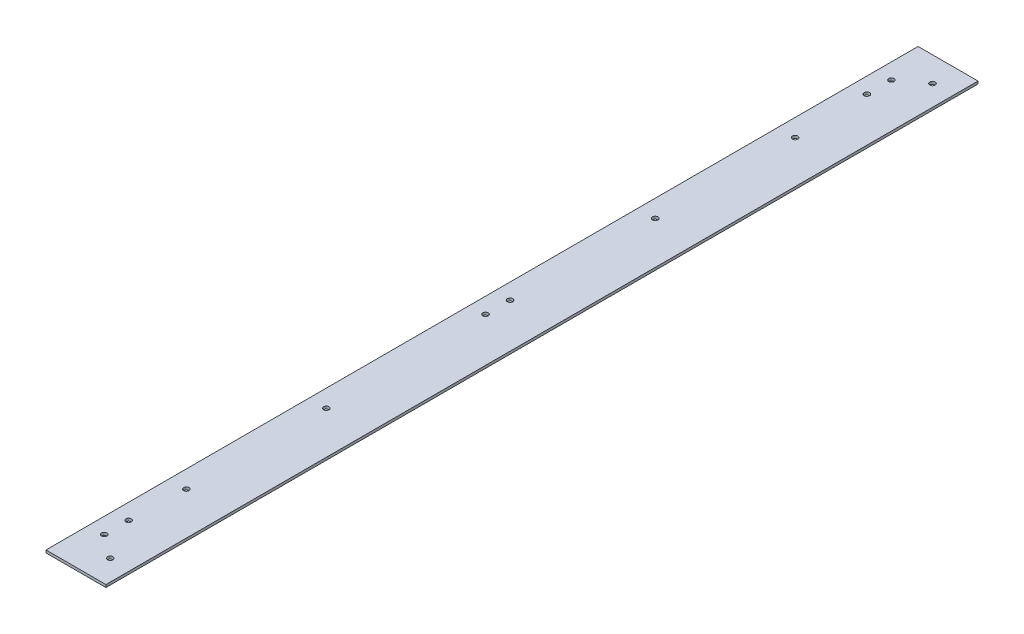
ISO-10303-21;
HEADER;
FILE_DESCRIPTION(('STEP AP214'),'2;1');
FILE_NAME('part.step','',(''),(''),'','','');
FILE_SCHEMA(('AUTOMOTIVE_DESIGN { 1 0 10303 214 1 1 1 1 }'));
ENDSEC;
DATA;
#1=APPLICATION_CONTEXT('core data for automotive mechanical design processes');
#2=APPLICATION_PROTOCOL_DEFINITION('international standard','automotive_design',2000,#1);
#3=PRODUCT_CONTEXT('',#1,'mechanical');
#4=PRODUCT('Part','Part','',(#3));
#5=PRODUCT_RELATED_PRODUCT_CATEGORY('part','',(#4));
#6=PRODUCT_DEFINITION_FORMATION('','',#4);
#7=PRODUCT_DEFINITION_CONTEXT('part definition',#1,'design');
#8=PRODUCT_DEFINITION('design','',#6,#7);
#9=PRODUCT_DEFINITION_SHAPE('','',#8);
#10=(LENGTH_UNIT() NAMED_UNIT(*) SI_UNIT(.MILLI.,.METRE.));
#11=(NAMED_UNIT(*) PLANE_ANGLE_UNIT() SI_UNIT($,.RADIAN.));
#12=(NAMED_UNIT(*) SI_UNIT($,.STERADIAN.) SOLID_ANGLE_UNIT());
#13=UNCERTAINTY_MEASURE_WITH_UNIT(LENGTH_MEASURE(1.E-05),#10,'distance_accuracy_value','');
#14=(GEOMETRIC_REPRESENTATION_CONTEXT(3) GLOBAL_UNCERTAINTY_ASSIGNED_CONTEXT((#13)) GLOBAL_UNIT_ASSIGNED_CONTEXT((#10,
#11,#12)) REPRESENTATION_CONTEXT('',''));
#15=CARTESIAN_POINT('',(0.,0.,0.));
#16=DIRECTION('',(0.,0.,1.));
#17=DIRECTION('',(1.,0.,0.));
#18=AXIS2_PLACEMENT_3D('',#15,#16,#17);
#19=CARTESIAN_POINT('',(0.,1.5,0.));
#20=DIRECTION('',(0.,1.,0.));
#21=DIRECTION('',(0.,0.,1.));
#22=AXIS2_PLACEMENT_3D('',#19,#20,#21);
#23=PLANE('',#22);
#24=CARTESIAN_POINT('',(22.5000000000001,1.5,485.));
#25=DIRECTION('',(0.,1.,0.));
#26=DIRECTION('',(0.,0.,1.));
#27=AXIS2_PLACEMENT_3D('',#24,#25,#26);
#28=CIRCLE('',#27,1.55000000000002);
#29=CARTESIAN_POINT('',(22.5000000000001,1.5,486.55));
#30=VERTEX_POINT('',#29);
#31=EDGE_CURVE('E172',#30,#30,#28,.T.);
#32=ORIENTED_EDGE('',*,*,#31,.F.);
#33=EDGE_LOOP('',(#32));
#34=FACE_BOUND('',#33,.T.);
#35=CARTESIAN_POINT('',(22.5,1.5,15.));
#36=DIRECTION('',(0.,1.,0.));
#37=DIRECTION('',(0.,0.,1.));
#38=AXIS2_PLACEMENT_3D('',#35,#36,#37);
#39=CIRCLE('',#38,1.55);
#40=CARTESIAN_POINT('',(22.5,1.5,16.55));
#41=VERTEX_POINT('',#40);
#42=EDGE_CURVE('E52',#41,#41,#39,.T.);
#43=ORIENTED_EDGE('',*,*,#42,.F.);
#44=EDGE_LOOP('',(#43));
#45=FACE_BOUND('',#44,.T.);
#46=CARTESIAN_POINT('',(9.,1.5,243.));
#47=DIRECTION('',(0.,1.,0.));
#48=DIRECTION('',(0.,0.,1.));
#49=AXIS2_PLACEMENT_3D('',#46,#47,#48);
#50=CIRCLE('',#49,1.54999999999999);
#51=CARTESIAN_POINT('',(9.,1.5,244.55));
#52=VERTEX_POINT('',#51);
#53=EDGE_CURVE('E178',#52,#52,#50,.T.);
#54=ORIENTED_EDGE('',*,*,#53,.F.);
#55=EDGE_LOOP('',(#54));
#56=FACE_BOUND('',#55,.T.);
#57=CARTESIAN_POINT('',(9.,1.5,475.));
#58=DIRECTION('',(0.,1.,0.));
#59=DIRECTION('',(0.,0.,1.));
#60=AXIS2_PLACEMENT_3D('',#57,#58,#59);
#61=CIRCLE('',#60,1.55000000000003);
#62=CARTESIAN_POINT('',(9.,1.5,476.55));
#63=VERTEX_POINT('',#62);
#64=EDGE_CURVE('E179',#63,#63,#61,.T.);
#65=ORIENTED_EDGE('',*,*,#64,.F.);
#66=EDGE_LOOP('',(#65));
#67=FACE_BOUND('',#66,.T.);
#68=CARTESIAN_POINT('',(9.,1.5,461.));
#69=DIRECTION('',(0.,1.,0.));
#70=DIRECTION('',(0.,0.,1.));
#71=AXIS2_PLACEMENT_3D('',#68,#69,#70);
#72=CIRCLE('',#71,1.55000000000003);
#73=CARTESIAN_POINT('',(9.,1.5,462.55));
#74=VERTEX_POINT('',#73);
#75=EDGE_CURVE('E186',#74,#74,#72,.T.);
#76=ORIENTED_EDGE('',*,*,#75,.F.);
#77=EDGE_LOOP('',(#76));
#78=FACE_BOUND('',#77,.T.);
#79=CARTESIAN_POINT('',(9.,1.5,39.));
#80=DIRECTION('',(0.,1.,0.));
#81=DIRECTION('',(0.,0.,1.));
#82=AXIS2_PLACEMENT_3D('',#79,#80,#81);
#83=CIRCLE('',#82,1.55);
#84=CARTESIAN_POINT('',(9.,1.5,40.55));
#85=VERTEX_POINT('',#84);
#86=EDGE_CURVE('E191',#85,#85,#83,.T.);
#87=ORIENTED_EDGE('',*,*,#86,.F.);
#88=EDGE_LOOP('',(#87));
#89=FACE_BOUND('',#88,.T.);
#90=CARTESIAN_POINT('',(9.,1.5,257.));
#91=DIRECTION('',(0.,1.,0.));
#92=DIRECTION('',(0.,0.,1.));
#93=AXIS2_PLACEMENT_3D('',#90,#91,#92);
#94=CIRCLE('',#93,1.55);
#95=CARTESIAN_POINT('',(9.,1.5,258.55));
#96=VERTEX_POINT('',#95);
#97=EDGE_CURVE('E144',#96,#96,#94,.T.);
#98=ORIENTED_EDGE('',*,*,#97,.F.);
#99=EDGE_LOOP('',(#98));
#100=FACE_BOUND('',#99,.T.);
#101=CARTESIAN_POINT('',(9.,1.5,25.));
#102=DIRECTION('',(0.,1.,0.));
#103=DIRECTION('',(0.,0.,1.));
#104=AXIS2_PLACEMENT_3D('',#101,#102,#103);
#105=CIRCLE('',#104,1.55);
#106=CARTESIAN_POINT('',(9.,1.5,26.55));
#107=VERTEX_POINT('',#106);
#108=EDGE_CURVE('E163',#107,#107,#105,.T.);
#109=ORIENTED_EDGE('',*,*,#108,.F.);
#110=EDGE_LOOP('',(#109));
#111=FACE_BOUND('',#110,.T.);
#112=CARTESIAN_POINT('',(10.0000000000001,1.5,429.));
#113=DIRECTION('',(0.,1.,0.));
#114=DIRECTION('',(0.,0.,1.));
#115=AXIS2_PLACEMENT_3D('',#112,#113,#114);
#116=CIRCLE('',#115,1.55000000000003);
#117=CARTESIAN_POINT('',(10.0000000000001,1.5,430.55));
#118=VERTEX_POINT('',#117);
#119=EDGE_CURVE('E122',#118,#118,#116,.T.);
#120=ORIENTED_EDGE('',*,*,#119,.F.);
#121=EDGE_LOOP('',(#120));
#122=FACE_BOUND('',#121,.T.);
#123=CARTESIAN_POINT('',(10.0000000000001,1.5,349.));
#124=DIRECTION('',(0.,1.,0.));
#125=DIRECTION('',(0.,0.,1.));
#126=AXIS2_PLACEMENT_3D('',#123,#124,#125);
#127=CIRCLE('',#126,1.55000000000001);
#128=CARTESIAN_POINT('',(10.0000000000001,1.5,350.55));
#129=VERTEX_POINT('',#128);
#130=EDGE_CURVE('E153',#129,#129,#127,.T.);
#131=ORIENTED_EDGE('',*,*,#130,.F.);
#132=EDGE_LOOP('',(#131));
#133=FACE_BOUND('',#132,.T.);
#134=CARTESIAN_POINT('',(10.,1.5,161.));
#135=DIRECTION('',(0.,1.,0.));
#136=DIRECTION('',(0.,0.,1.));
#137=AXIS2_PLACEMENT_3D('',#134,#135,#136);
#138=CIRCLE('',#137,1.54999999999999);
#139=CARTESIAN_POINT('',(10.,1.5,162.55));
#140=VERTEX_POINT('',#139);
#141=EDGE_CURVE('E145',#140,#140,#138,.T.);
#142=ORIENTED_EDGE('',*,*,#141,.F.);
#143=EDGE_LOOP('',(#142));
#144=FACE_BOUND('',#143,.T.);
#145=CARTESIAN_POINT('',(10.,1.5,81.));
#146=DIRECTION('',(0.,1.,0.));
#147=DIRECTION('',(0.,0.,1.));
#148=AXIS2_PLACEMENT_3D('',#145,#146,#147);
#149=CIRCLE('',#148,1.54999999999999);
#150=CARTESIAN_POINT('',(10.,1.5,82.55));
#151=VERTEX_POINT('',#150);
#152=EDGE_CURVE('E135',#151,#151,#149,.T.);
#153=ORIENTED_EDGE('',*,*,#152,.F.);
#154=EDGE_LOOP('',(#153));
#155=FACE_BOUND('',#154,.T.);
#156=DIRECTION('',(-1.,0.,0.));
#157=VECTOR('',#156,1.);
#158=CARTESIAN_POINT('',(34.25,1.5,0.75));
#159=LINE('',#158,#157);
#160=CARTESIAN_POINT('',(34.25,1.5,0.75));
#161=VERTEX_POINT('',#160);
#162=CARTESIAN_POINT('',(0.,1.5,0.75));
#163=VERTEX_POINT('',#162);
#164=EDGE_CURVE('E90',#161,#163,#159,.T.);
#165=ORIENTED_EDGE('',*,*,#164,.T.);
#166=DIRECTION('',(0.,0.,1.));
#167=VECTOR('',#166,1.);
#168=CARTESIAN_POINT('',(0.,1.5,0.75));
#169=LINE('',#168,#167);
#170=CARTESIAN_POINT('',(0.,1.5,499.25));
#171=VERTEX_POINT('',#170);
#172=EDGE_CURVE('E94',#163,#171,#169,.T.);
#173=ORIENTED_EDGE('',*,*,#172,.T.);
#174=DIRECTION('',(1.,0.,0.));
#175=VECTOR('',#174,1.);
#176=CARTESIAN_POINT('',(0.750000000000061,1.5,499.25));
#177=LINE('',#176,#175);
#178=CARTESIAN_POINT('',(34.2500000000001,1.5,499.25));
#179=VERTEX_POINT('',#178);
#180=EDGE_CURVE('E98',#171,#179,#177,.T.);
#181=ORIENTED_EDGE('',*,*,#180,.T.);
#182=DIRECTION('',(0.,0.,-1.));
#183=VECTOR('',#182,1.);
#184=CARTESIAN_POINT('',(34.2500000000001,1.5,499.25));
#185=LINE('',#184,#183);
#186=EDGE_CURVE('E96',#179,#161,#185,.T.);
#187=ORIENTED_EDGE('',*,*,#186,.T.);
#188=EDGE_LOOP('',(#165,#173,#181,#187));
#189=FACE_BOUND('',#188,.T.);
#190=ADVANCED_FACE('F42',(#34,#45,#56,#67,#78,#89,#100,#111,#122,#133,#144,#155,#189),#23,.T.);
#191=CARTESIAN_POINT('',(0.,0.,0.));
#192=DIRECTION('',(0.,1.,0.));
#193=DIRECTION('',(0.,0.,1.));
#194=AXIS2_PLACEMENT_3D('',#191,#192,#193);
#195=PLANE('',#194);
#196=CARTESIAN_POINT('',(22.5000000000001,0.,485.));
#197=DIRECTION('',(0.,1.,0.));
#198=DIRECTION('',(0.,0.,1.));
#199=AXIS2_PLACEMENT_3D('',#196,#197,#198);
#200=CIRCLE('',#199,1.55000000000002);
#201=CARTESIAN_POINT('',(22.5000000000001,0.,486.55));
#202=VERTEX_POINT('',#201);
#203=EDGE_CURVE('E46',#202,#202,#200,.F.);
#204=ORIENTED_EDGE('',*,*,#203,.F.);
#205=EDGE_LOOP('',(#204));
#206=FACE_BOUND('',#205,.T.);
#207=CARTESIAN_POINT('',(22.5,0.,15.));
#208=DIRECTION('',(0.,1.,0.));
#209=DIRECTION('',(0.,0.,1.));
#210=AXIS2_PLACEMENT_3D('',#207,#208,#209);
#211=CIRCLE('',#210,1.55);
#212=CARTESIAN_POINT('',(22.5,0.,16.55));
#213=VERTEX_POINT('',#212);
#214=EDGE_CURVE('E12',#213,#213,#211,.F.);
#215=ORIENTED_EDGE('',*,*,#214,.F.);
#216=EDGE_LOOP('',(#215));
#217=FACE_BOUND('',#216,.T.);
#218=CARTESIAN_POINT('',(9.,0.,243.));
#219=DIRECTION('',(0.,1.,0.));
#220=DIRECTION('',(0.,0.,1.));
#221=AXIS2_PLACEMENT_3D('',#218,#219,#220);
#222=CIRCLE('',#221,1.54999999999999);
#223=CARTESIAN_POINT('',(9.,0.,244.55));
#224=VERTEX_POINT('',#223);
#225=EDGE_CURVE('E183',#224,#224,#222,.F.);
#226=ORIENTED_EDGE('',*,*,#225,.F.);
#227=EDGE_LOOP('',(#226));
#228=FACE_BOUND('',#227,.T.);
#229=CARTESIAN_POINT('',(9.,0.,475.));
#230=DIRECTION('',(0.,1.,0.));
#231=DIRECTION('',(0.,0.,1.));
#232=AXIS2_PLACEMENT_3D('',#229,#230,#231);
#233=CIRCLE('',#232,1.55000000000003);
#234=CARTESIAN_POINT('',(9.,0.,476.55));
#235=VERTEX_POINT('',#234);
#236=EDGE_CURVE('E182',#235,#235,#233,.F.);
#237=ORIENTED_EDGE('',*,*,#236,.F.);
#238=EDGE_LOOP('',(#237));
#239=FACE_BOUND('',#238,.T.);
#240=CARTESIAN_POINT('',(9.,0.,461.));
#241=DIRECTION('',(0.,1.,0.));
#242=DIRECTION('',(0.,0.,1.));
#243=AXIS2_PLACEMENT_3D('',#240,#241,#242);
#244=CIRCLE('',#243,1.55000000000003);
#245=CARTESIAN_POINT('',(9.,0.,462.55));
#246=VERTEX_POINT('',#245);
#247=EDGE_CURVE('E195',#246,#246,#244,.F.);
#248=ORIENTED_EDGE('',*,*,#247,.F.);
#249=EDGE_LOOP('',(#248));
#250=FACE_BOUND('',#249,.T.);
#251=CARTESIAN_POINT('',(9.,0.,39.));
#252=DIRECTION('',(0.,1.,0.));
#253=DIRECTION('',(0.,0.,1.));
#254=AXIS2_PLACEMENT_3D('',#251,#252,#253);
#255=CIRCLE('',#254,1.55);
#256=CARTESIAN_POINT('',(9.,0.,40.55));
#257=VERTEX_POINT('',#256);
#258=EDGE_CURVE('E168',#257,#257,#255,.F.);
#259=ORIENTED_EDGE('',*,*,#258,.F.);
#260=EDGE_LOOP('',(#259));
#261=FACE_BOUND('',#260,.T.);
#262=CARTESIAN_POINT('',(9.,0.,257.));
#263=DIRECTION('',(0.,1.,0.));
#264=DIRECTION('',(0.,0.,1.));
#265=AXIS2_PLACEMENT_3D('',#262,#263,#264);
#266=CIRCLE('',#265,1.55);
#267=CARTESIAN_POINT('',(9.,0.,258.55));
#268=VERTEX_POINT('',#267);
#269=EDGE_CURVE('E175',#268,#268,#266,.F.);
#270=ORIENTED_EDGE('',*,*,#269,.F.);
#271=EDGE_LOOP('',(#270));
#272=FACE_BOUND('',#271,.T.);
#273=CARTESIAN_POINT('',(9.,0.,25.));
#274=DIRECTION('',(0.,1.,0.));
#275=DIRECTION('',(0.,0.,1.));
#276=AXIS2_PLACEMENT_3D('',#273,#274,#275);
#277=CIRCLE('',#276,1.55);
#278=CARTESIAN_POINT('',(9.,0.,26.55));
#279=VERTEX_POINT('',#278);
#280=EDGE_CURVE('E167',#279,#279,#277,.F.);
#281=ORIENTED_EDGE('',*,*,#280,.F.);
#282=EDGE_LOOP('',(#281));
#283=FACE_BOUND('',#282,.T.);
#284=CARTESIAN_POINT('',(10.0000000000001,0.,429.));
#285=DIRECTION('',(0.,1.,0.));
#286=DIRECTION('',(0.,0.,1.));
#287=AXIS2_PLACEMENT_3D('',#284,#285,#286);
#288=CIRCLE('',#287,1.55000000000003);
#289=CARTESIAN_POINT('',(10.0000000000001,0.,430.55));
#290=VERTEX_POINT('',#289);
#291=EDGE_CURVE('E156',#290,#290,#288,.F.);
#292=ORIENTED_EDGE('',*,*,#291,.F.);
#293=EDGE_LOOP('',(#292));
#294=FACE_BOUND('',#293,.T.);
#295=CARTESIAN_POINT('',(10.0000000000001,0.,349.));
#296=DIRECTION('',(0.,1.,0.));
#297=DIRECTION('',(0.,0.,1.));
#298=AXIS2_PLACEMENT_3D('',#295,#296,#297);
#299=CIRCLE('',#298,1.55000000000001);
#300=CARTESIAN_POINT('',(10.0000000000001,0.,350.55));
#301=VERTEX_POINT('',#300);
#302=EDGE_CURVE('E149',#301,#301,#299,.F.);
#303=ORIENTED_EDGE('',*,*,#302,.F.);
#304=EDGE_LOOP('',(#303));
#305=FACE_BOUND('',#304,.T.);
#306=CARTESIAN_POINT('',(10.,0.,161.));
#307=DIRECTION('',(0.,1.,0.));
#308=DIRECTION('',(0.,0.,1.));
#309=AXIS2_PLACEMENT_3D('',#306,#307,#308);
#310=CIRCLE('',#309,1.54999999999999);
#311=CARTESIAN_POINT('',(10.,0.,162.55));
#312=VERTEX_POINT('',#311);
#313=EDGE_CURVE('E140',#312,#312,#310,.F.);
#314=ORIENTED_EDGE('',*,*,#313,.F.);
#315=EDGE_LOOP('',(#314));
#316=FACE_BOUND('',#315,.T.);
#317=CARTESIAN_POINT('',(10.,0.,81.));
#318=DIRECTION('',(0.,1.,0.));
#319=DIRECTION('',(0.,0.,1.));
#320=AXIS2_PLACEMENT_3D('',#317,#318,#319);
#321=CIRCLE('',#320,1.54999999999999);
#322=CARTESIAN_POINT('',(10.,0.,82.55));
#323=VERTEX_POINT('',#322);
#324=EDGE_CURVE('E139',#323,#323,#321,.F.);
#325=ORIENTED_EDGE('',*,*,#324,.F.);
#326=EDGE_LOOP('',(#325));
#327=FACE_BOUND('',#326,.T.);
#328=DIRECTION('',(-1.,0.,0.));
#329=VECTOR('',#328,1.);
#330=CARTESIAN_POINT('',(0.750000000000061,0.,499.25));
#331=LINE('',#330,#329);
#332=CARTESIAN_POINT('',(34.2500000000001,0.,499.25));
#333=VERTEX_POINT('',#332);
#334=CARTESIAN_POINT('',(0.,0.,499.25));
#335=VERTEX_POINT('',#334);
#336=EDGE_CURVE('E70',#333,#335,#331,.T.);
#337=ORIENTED_EDGE('',*,*,#336,.T.);
#338=DIRECTION('',(0.,0.,-1.));
#339=VECTOR('',#338,1.);
#340=CARTESIAN_POINT('',(0.,0.,0.75));
#341=LINE('',#340,#339);
#342=CARTESIAN_POINT('',(0.,0.,0.75));
#343=VERTEX_POINT('',#342);
#344=EDGE_CURVE('E99',#335,#343,#341,.T.);
#345=ORIENTED_EDGE('',*,*,#344,.T.);
#346=DIRECTION('',(1.,0.,0.));
#347=VECTOR('',#346,1.);
#348=CARTESIAN_POINT('',(34.25,0.,0.75));
#349=LINE('',#348,#347);
#350=CARTESIAN_POINT('',(34.25,0.,0.75));
#351=VERTEX_POINT('',#350);
#352=EDGE_CURVE('E105',#343,#351,#349,.T.);
#353=ORIENTED_EDGE('',*,*,#352,.T.);
#354=DIRECTION('',(0.,0.,1.));
#355=VECTOR('',#354,1.);
#356=CARTESIAN_POINT('',(34.2500000000001,0.,499.25));
#357=LINE('',#356,#355);
#358=EDGE_CURVE('E123',#351,#333,#357,.T.);
#359=ORIENTED_EDGE('',*,*,#358,.T.);
#360=EDGE_LOOP('',(#337,#345,#353,#359));
#361=FACE_BOUND('',#360,.T.);
#362=ADVANCED_FACE('F44',(#206,#217,#228,#239,#250,#261,#272,#283,#294,#305,#316,#327,#361),
#195,.F.);
#363=CARTESIAN_POINT('',(22.5000000000001,-4.38406204335662,485.));
#364=DIRECTION('',(0.,1.,0.));
#365=DIRECTION('',(0.,0.,1.));
#366=AXIS2_PLACEMENT_3D('',#363,#364,#365);
#367=CYLINDRICAL_SURFACE('',#366,1.55000000000002);
#368=CARTESIAN_POINT('',(22.5000000000001,0.,486.55));
#369=CARTESIAN_POINT('',(22.5000000000001,0.0156249999999991,486.55));
#370=CARTESIAN_POINT('',(22.5000000000001,0.0312499999999992,486.55));
#371=CARTESIAN_POINT('',(22.5000000000001,0.0624999999999992,486.55));
#372=CARTESIAN_POINT('',(22.5000000000001,0.0781249999999992,486.55));
#373=CARTESIAN_POINT('',(22.5000000000001,0.109374999999999,486.55));
#374=CARTESIAN_POINT('',(22.5000000000001,0.124999999999999,486.55));
#375=CARTESIAN_POINT('',(22.5000000000001,0.156249999999999,486.55));
#376=CARTESIAN_POINT('',(22.5000000000001,0.171874999999999,486.55));
#377=CARTESIAN_POINT('',(22.5000000000001,0.203124999999999,486.55));
#378=CARTESIAN_POINT('',(22.5000000000001,0.218749999999999,486.55));
#379=CARTESIAN_POINT('',(22.5000000000001,0.249999999999999,486.55));
#380=CARTESIAN_POINT('',(22.5000000000001,0.265624999999999,486.55));
#381=CARTESIAN_POINT('',(22.5000000000001,0.296874999999999,486.55));
#382=CARTESIAN_POINT('',(22.5000000000001,0.312499999999999,486.55));
#383=CARTESIAN_POINT('',(22.5000000000001,0.343749999999999,486.55));
#384=CARTESIAN_POINT('',(22.5000000000001,0.359374999999999,486.55));
#385=CARTESIAN_POINT('',(22.5000000000001,0.390625,486.55));
#386=CARTESIAN_POINT('',(22.5000000000001,0.40625,486.55));
#387=CARTESIAN_POINT('',(22.5000000000001,0.4375,486.55));
#388=CARTESIAN_POINT('',(22.5000000000001,0.453125,486.55));
#389=CARTESIAN_POINT('',(22.5000000000001,0.484375,486.55));
#390=CARTESIAN_POINT('',(22.5000000000001,0.5,486.55));
#391=CARTESIAN_POINT('',(22.5000000000001,0.53125,486.55));
#392=CARTESIAN_POINT('',(22.5000000000001,0.546875,486.55));
#393=CARTESIAN_POINT('',(22.5000000000001,0.578125,486.55));
#394=CARTESIAN_POINT('',(22.5000000000001,0.59375,486.55));
#395=CARTESIAN_POINT('',(22.5000000000001,0.625,486.55));
#396=CARTESIAN_POINT('',(22.5000000000001,0.640625,486.55));
#397=CARTESIAN_POINT('',(22.5000000000001,0.671875,486.55));
#398=CARTESIAN_POINT('',(22.5000000000001,0.6875,486.55));
#399=CARTESIAN_POINT('',(22.5000000000001,0.71875,486.55));
#400=CARTESIAN_POINT('',(22.5000000000001,0.734375,486.55));
#401=CARTESIAN_POINT('',(22.5000000000001,0.765625,486.55));
#402=CARTESIAN_POINT('',(22.5000000000001,0.78125,486.55));
#403=CARTESIAN_POINT('',(22.5000000000001,0.8125,486.55));
#404=CARTESIAN_POINT('',(22.5000000000001,0.828125,486.55));
#405=CARTESIAN_POINT('',(22.5000000000001,0.859375,486.55));
#406=CARTESIAN_POINT('',(22.5000000000001,0.875,486.55));
#407=CARTESIAN_POINT('',(22.5000000000001,0.90625,486.55));
#408=CARTESIAN_POINT('',(22.5000000000001,0.921875,486.55));
#409=CARTESIAN_POINT('',(22.5000000000001,0.953125,486.55));
#410=CARTESIAN_POINT('',(22.5000000000001,0.96875,486.55));
#411=CARTESIAN_POINT('',(22.5000000000001,1.,486.55));
#412=CARTESIAN_POINT('',(22.5000000000001,1.015625,486.55));
#413=CARTESIAN_POINT('',(22.5000000000001,1.046875,486.55));
#414=CARTESIAN_POINT('',(22.5000000000001,1.0625,486.55));
#415=CARTESIAN_POINT('',(22.5000000000001,1.09375,486.55));
#416=CARTESIAN_POINT('',(22.5000000000001,1.109375,486.55));
#417=CARTESIAN_POINT('',(22.5000000000001,1.140625,486.55));
#418=CARTESIAN_POINT('',(22.5000000000001,1.15625,486.55));
#419=CARTESIAN_POINT('',(22.5000000000001,1.1875,486.55));
#420=CARTESIAN_POINT('',(22.5000000000001,1.203125,486.55));
#421=CARTESIAN_POINT('',(22.5000000000001,1.234375,486.55));
#422=CARTESIAN_POINT('',(22.5000000000001,1.25,486.55));
#423=CARTESIAN_POINT('',(22.5000000000001,1.28125,486.55));
#424=CARTESIAN_POINT('',(22.5000000000001,1.296875,486.55));
#425=CARTESIAN_POINT('',(22.5000000000001,1.328125,486.55));
#426=CARTESIAN_POINT('',(22.5000000000001,1.34375,486.55));
#427=CARTESIAN_POINT('',(22.5000000000001,1.375,486.55));
#428=CARTESIAN_POINT('',(22.5000000000001,1.390625,486.55));
#429=CARTESIAN_POINT('',(22.5000000000001,1.421875,486.55));
#430=CARTESIAN_POINT('',(22.5000000000001,1.4375,486.55));
#431=CARTESIAN_POINT('',(22.5000000000001,1.46875,486.55));
#432=CARTESIAN_POINT('',(22.5000000000001,1.484375,486.55));
#433=CARTESIAN_POINT('',(22.5000000000001,1.5,486.55));
#434=B_SPLINE_CURVE_WITH_KNOTS('',3,(#368,#369,#370,#371,#372,#373,#374,#375,#376,#377,#378,
#379,#380,#381,#382,#383,#384,#385,#386,#387,#388,#389,#390,#391,#392,#393,#394,#395,#396,#397,
#398,#399,#400,#401,#402,#403,#404,#405,#406,#407,#408,#409,#410,#411,#412,#413,#414,#415,#416,
#417,#418,#419,#420,#421,#422,#423,#424,#425,#426,#427,#428,#429,#430,#431,#432,#433),
.UNSPECIFIED.,.F.,.F.,(4,2,2,2,2,2,2,2,2,2,2,2,2,2,2,2,2,2,2,2,2,2,2,2,2,2,2,2,2,2,2,2,4),(0.,
0.046875,0.0937500000000001,0.140625,0.1875,0.234375,0.28125,0.328125,0.375,0.421875,0.46875,
0.515625,0.5625,0.609375000000001,0.656250000000001,0.703125000000001,0.750000000000001,
0.796875000000001,0.843750000000001,0.890625000000001,0.937500000000001,0.984375000000001,
1.03125,1.078125,1.125,1.171875,1.21875,1.265625,1.3125,1.359375,1.40625,1.453125,1.5),.UNSPECIFIED.);
#435=EDGE_CURVE('BSEAM211',#202,#30,#434,.T.);
#436=ORIENTED_EDGE('',*,*,#203,.T.);
#437=ORIENTED_EDGE('',*,*,#31,.T.);
#438=ORIENTED_EDGE('',*,*,#435,.T.);
#439=ORIENTED_EDGE('',*,*,#435,.F.);
#440=EDGE_LOOP('',(#436,#438,#437,#439));
#441=FACE_BOUND('',#440,.T.);
#442=ADVANCED_FACE('F211',(#441),#367,.F.);
#443=CARTESIAN_POINT('',(22.5,-4.38406204335662,15.));
#444=DIRECTION('',(0.,1.,0.));
#445=DIRECTION('',(0.,0.,1.));
#446=AXIS2_PLACEMENT_3D('',#443,#444,#445);
#447=CYLINDRICAL_SURFACE('',#446,1.55);
#448=CARTESIAN_POINT('',(22.5,0.,16.55));
#449=CARTESIAN_POINT('',(22.5,0.0156249999999991,16.55));
#450=CARTESIAN_POINT('',(22.5,0.0312499999999992,16.55));
#451=CARTESIAN_POINT('',(22.5,0.0624999999999992,16.55));
#452=CARTESIAN_POINT('',(22.5,0.0781249999999992,16.55));
#453=CARTESIAN_POINT('',(22.5,0.109374999999999,16.55));
#454=CARTESIAN_POINT('',(22.5,0.124999999999999,16.55));
#455=CARTESIAN_POINT('',(22.5,0.156249999999999,16.55));
#456=CARTESIAN_POINT('',(22.5,0.171874999999999,16.55));
#457=CARTESIAN_POINT('',(22.5,0.203124999999999,16.55));
#458=CARTESIAN_POINT('',(22.5,0.218749999999999,16.55));
#459=CARTESIAN_POINT('',(22.5,0.249999999999999,16.55));
#460=CARTESIAN_POINT('',(22.5,0.265624999999999,16.55));
#461=CARTESIAN_POINT('',(22.5,0.296874999999999,16.55));
#462=CARTESIAN_POINT('',(22.5,0.312499999999999,16.55));
#463=CARTESIAN_POINT('',(22.5,0.343749999999999,16.55));
#464=CARTESIAN_POINT('',(22.5,0.359374999999999,16.55));
#465=CARTESIAN_POINT('',(22.5,0.390625,16.55));
#466=CARTESIAN_POINT('',(22.5,0.40625,16.55));
#467=CARTESIAN_POINT('',(22.5,0.4375,16.55));
#468=CARTESIAN_POINT('',(22.5,0.453125,16.55));
#469=CARTESIAN_POINT('',(22.5,0.484375,16.55));
#470=CARTESIAN_POINT('',(22.5,0.5,16.55));
#471=CARTESIAN_POINT('',(22.5,0.53125,16.55));
#472=CARTESIAN_POINT('',(22.5,0.546875,16.55));
#473=CARTESIAN_POINT('',(22.5,0.578125,16.55));
#474=CARTESIAN_POINT('',(22.5,0.59375,16.55));
#475=CARTESIAN_POINT('',(22.5,0.625,16.55));
#476=CARTESIAN_POINT('',(22.5,0.640625,16.55));
#477=CARTESIAN_POINT('',(22.5,0.671875,16.55));
#478=CARTESIAN_POINT('',(22.5,0.6875,16.55));
#479=CARTESIAN_POINT('',(22.5,0.71875,16.55));
#480=CARTESIAN_POINT('',(22.5,0.734375,16.55));
#481=CARTESIAN_POINT('',(22.5,0.765625,16.55));
#482=CARTESIAN_POINT('',(22.5,0.78125,16.55));
#483=CARTESIAN_POINT('',(22.5,0.8125,16.55));
#484=CARTESIAN_POINT('',(22.5,0.828125,16.55));
#485=CARTESIAN_POINT('',(22.5,0.859375,16.55));
#486=CARTESIAN_POINT('',(22.5,0.875,16.55));
#487=CARTESIAN_POINT('',(22.5,0.90625,16.55));
#488=CARTESIAN_POINT('',(22.5,0.921875,16.55));
#489=CARTESIAN_POINT('',(22.5,0.953125,16.55));
#490=CARTESIAN_POINT('',(22.5,0.96875,16.55));
#491=CARTESIAN_POINT('',(22.5,1.,16.55));
#492=CARTESIAN_POINT('',(22.5,1.015625,16.55));
#493=CARTESIAN_POINT('',(22.5,1.046875,16.55));
#494=CARTESIAN_POINT('',(22.5,1.0625,16.55));
#495=CARTESIAN_POINT('',(22.5,1.09375,16.55));
#496=CARTESIAN_POINT('',(22.5,1.109375,16.55));
#497=CARTESIAN_POINT('',(22.5,1.140625,16.55));
#498=CARTESIAN_POINT('',(22.5,1.15625,16.55));
#499=CARTESIAN_POINT('',(22.5,1.1875,16.55));
#500=CARTESIAN_POINT('',(22.5,1.203125,16.55));
#501=CARTESIAN_POINT('',(22.5,1.234375,16.55));
#502=CARTESIAN_POINT('',(22.5,1.25,16.55));
#503=CARTESIAN_POINT('',(22.5,1.28125,16.55));
#504=CARTESIAN_POINT('',(22.5,1.296875,16.55));
#505=CARTESIAN_POINT('',(22.5,1.328125,16.55));
#506=CARTESIAN_POINT('',(22.5,1.34375,16.55));
#507=CARTESIAN_POINT('',(22.5,1.375,16.55));
#508=CARTESIAN_POINT('',(22.5,1.390625,16.55));
#509=CARTESIAN_POINT('',(22.5,1.421875,16.55));
#510=CARTESIAN_POINT('',(22.5,1.4375,16.55));
#511=CARTESIAN_POINT('',(22.5,1.46875,16.55));
#512=CARTESIAN_POINT('',(22.5,1.484375,16.55));
#513=CARTESIAN_POINT('',(22.5,1.5,16.55));
#514=B_SPLINE_CURVE_WITH_KNOTS('',3,(#448,#449,#450,#451,#452,#453,#454,#455,#456,#457,#458,
#459,#460,#461,#462,#463,#464,#465,#466,#467,#468,#469,#470,#471,#472,#473,#474,#475,#476,#477,
#478,#479,#480,#481,#482,#483,#484,#485,#486,#487,#488,#489,#490,#491,#492,#493,#494,#495,#496,
#497,#498,#499,#500,#501,#502,#503,#504,#505,#506,#507,#508,#509,#510,#511,#512,#513),
.UNSPECIFIED.,.F.,.F.,(4,2,2,2,2,2,2,2,2,2,2,2,2,2,2,2,2,2,2,2,2,2,2,2,2,2,2,2,2,2,2,2,4),(0.,
0.046875,0.0937500000000001,0.140625,0.1875,0.234375,0.28125,0.328125,0.375,0.421875,0.46875,
0.515625,0.5625,0.609375000000001,0.656250000000001,0.703125000000001,0.750000000000001,
0.796875000000001,0.843750000000001,0.890625000000001,0.937500000000001,0.984375000000001,
1.03125,1.078125,1.125,1.171875,1.21875,1.265625,1.3125,1.359375,1.40625,1.453125,1.5),.UNSPECIFIED.);
#515=EDGE_CURVE('BSEAM259',#213,#41,#514,.T.);
#516=ORIENTED_EDGE('',*,*,#214,.T.);
#517=ORIENTED_EDGE('',*,*,#42,.T.);
#518=ORIENTED_EDGE('',*,*,#515,.T.);
#519=ORIENTED_EDGE('',*,*,#515,.F.);
#520=EDGE_LOOP('',(#516,#518,#517,#519));
#521=FACE_BOUND('',#520,.T.);
#522=ADVANCED_FACE('F259',(#521),#447,.F.);
#523=CARTESIAN_POINT('',(9.,-4.38406204335671,243.));
#524=DIRECTION('',(0.,1.,0.));
#525=DIRECTION('',(0.,0.,1.));
#526=AXIS2_PLACEMENT_3D('',#523,#524,#525);
#527=CYLINDRICAL_SURFACE('',#526,1.54999999999999);
#528=ORIENTED_EDGE('',*,*,#225,.T.);
#529=EDGE_LOOP('',(#528));
#530=FACE_BOUND('',#529,.T.);
#531=ORIENTED_EDGE('',*,*,#53,.T.);
#532=EDGE_LOOP('',(#531));
#533=FACE_BOUND('',#532,.T.);
#534=ADVANCED_FACE('F262',(#530,#533),#527,.F.);
#535=CARTESIAN_POINT('',(9.,-4.38406204335671,475.));
#536=DIRECTION('',(0.,1.,0.));
#537=DIRECTION('',(0.,0.,1.));
#538=AXIS2_PLACEMENT_3D('',#535,#536,#537);
#539=CYLINDRICAL_SURFACE('',#538,1.55000000000003);
#540=ORIENTED_EDGE('',*,*,#236,.T.);
#541=EDGE_LOOP('',(#540));
#542=FACE_BOUND('',#541,.T.);
#543=ORIENTED_EDGE('',*,*,#64,.T.);
#544=EDGE_LOOP('',(#543));
#545=FACE_BOUND('',#544,.T.);
#546=ADVANCED_FACE('F268',(#542,#545),#539,.F.);
#547=CARTESIAN_POINT('',(9.,-4.38406204335671,461.));
#548=DIRECTION('',(0.,1.,0.));
#549=DIRECTION('',(0.,0.,1.));
#550=AXIS2_PLACEMENT_3D('',#547,#548,#549);
#551=CYLINDRICAL_SURFACE('',#550,1.55000000000003);
#552=ORIENTED_EDGE('',*,*,#247,.T.);
#553=EDGE_LOOP('',(#552));
#554=FACE_BOUND('',#553,.T.);
#555=ORIENTED_EDGE('',*,*,#75,.T.);
#556=EDGE_LOOP('',(#555));
#557=FACE_BOUND('',#556,.T.);
#558=ADVANCED_FACE('F264',(#554,#557),#551,.F.);
#559=CARTESIAN_POINT('',(9.,-4.38406204335671,39.));
#560=DIRECTION('',(0.,1.,0.));
#561=DIRECTION('',(0.,0.,1.));
#562=AXIS2_PLACEMENT_3D('',#559,#560,#561);
#563=CYLINDRICAL_SURFACE('',#562,1.55);
#564=ORIENTED_EDGE('',*,*,#258,.T.);
#565=EDGE_LOOP('',(#564));
#566=FACE_BOUND('',#565,.T.);
#567=ORIENTED_EDGE('',*,*,#86,.T.);
#568=EDGE_LOOP('',(#567));
#569=FACE_BOUND('',#568,.T.);
#570=ADVANCED_FACE('F267',(#566,#569),#563,.F.);
#571=CARTESIAN_POINT('',(9.,-4.38406204335671,257.));
#572=DIRECTION('',(0.,1.,0.));
#573=DIRECTION('',(0.,0.,1.));
#574=AXIS2_PLACEMENT_3D('',#571,#572,#573);
#575=CYLINDRICAL_SURFACE('',#574,1.55);
#576=ORIENTED_EDGE('',*,*,#269,.T.);
#577=EDGE_LOOP('',(#576));
#578=FACE_BOUND('',#577,.T.);
#579=ORIENTED_EDGE('',*,*,#97,.T.);
#580=EDGE_LOOP('',(#579));
#581=FACE_BOUND('',#580,.T.);
#582=ADVANCED_FACE('F272',(#578,#581),#575,.F.);
#583=CARTESIAN_POINT('',(9.,-4.38406204335671,25.));
#584=DIRECTION('',(0.,1.,0.));
#585=DIRECTION('',(0.,0.,1.));
#586=AXIS2_PLACEMENT_3D('',#583,#584,#585);
#587=CYLINDRICAL_SURFACE('',#586,1.55);
#588=ORIENTED_EDGE('',*,*,#280,.T.);
#589=EDGE_LOOP('',(#588));
#590=FACE_BOUND('',#589,.T.);
#591=ORIENTED_EDGE('',*,*,#108,.T.);
#592=EDGE_LOOP('',(#591));
#593=FACE_BOUND('',#592,.T.);
#594=ADVANCED_FACE('F282',(#590,#593),#587,.F.);
#595=CARTESIAN_POINT('',(10.0000000000001,-4.3840620433567,429.));
#596=DIRECTION('',(0.,1.,0.));
#597=DIRECTION('',(0.,0.,1.));
#598=AXIS2_PLACEMENT_3D('',#595,#596,#597);
#599=CYLINDRICAL_SURFACE('',#598,1.55000000000003);
#600=ORIENTED_EDGE('',*,*,#291,.T.);
#601=EDGE_LOOP('',(#600));
#602=FACE_BOUND('',#601,.T.);
#603=ORIENTED_EDGE('',*,*,#119,.T.);
#604=EDGE_LOOP('',(#603));
#605=FACE_BOUND('',#604,.T.);
#606=ADVANCED_FACE('F286',(#602,#605),#599,.F.);
#607=CARTESIAN_POINT('',(10.0000000000001,-4.3840620433567,349.));
#608=DIRECTION('',(0.,1.,0.));
#609=DIRECTION('',(0.,0.,1.));
#610=AXIS2_PLACEMENT_3D('',#607,#608,#609);
#611=CYLINDRICAL_SURFACE('',#610,1.55000000000001);
#612=ORIENTED_EDGE('',*,*,#302,.T.);
#613=EDGE_LOOP('',(#612));
#614=FACE_BOUND('',#613,.T.);
#615=ORIENTED_EDGE('',*,*,#130,.T.);
#616=EDGE_LOOP('',(#615));
#617=FACE_BOUND('',#616,.T.);
#618=ADVANCED_FACE('F290',(#614,#617),#611,.F.);
#619=CARTESIAN_POINT('',(10.,-4.3840620433567,161.));
#620=DIRECTION('',(0.,1.,0.));
#621=DIRECTION('',(0.,0.,1.));
#622=AXIS2_PLACEMENT_3D('',#619,#620,#621);
#623=CYLINDRICAL_SURFACE('',#622,1.54999999999999);
#624=ORIENTED_EDGE('',*,*,#313,.T.);
#625=EDGE_LOOP('',(#624));
#626=FACE_BOUND('',#625,.T.);
#627=ORIENTED_EDGE('',*,*,#141,.T.);
#628=EDGE_LOOP('',(#627));
#629=FACE_BOUND('',#628,.T.);
#630=ADVANCED_FACE('F294',(#626,#629),#623,.F.);
#631=CARTESIAN_POINT('',(10.,-4.3840620433567,81.));
#632=DIRECTION('',(0.,1.,0.));
#633=DIRECTION('',(0.,0.,1.));
#634=AXIS2_PLACEMENT_3D('',#631,#632,#633);
#635=CYLINDRICAL_SURFACE('',#634,1.54999999999999);
#636=ORIENTED_EDGE('',*,*,#324,.T.);
#637=EDGE_LOOP('',(#636));
#638=FACE_BOUND('',#637,.T.);
#639=ORIENTED_EDGE('',*,*,#152,.T.);
#640=EDGE_LOOP('',(#639));
#641=FACE_BOUND('',#640,.T.);
#642=ADVANCED_FACE('F249',(#638,#641),#635,.F.);
#643=CARTESIAN_POINT('',(0.750000000000061,-506.235738070713,499.25));
#644=DIRECTION('',(0.,0.,1.));
#645=DIRECTION('',(1.,0.,0.));
#646=AXIS2_PLACEMENT_3D('',#643,#644,#645);
#647=PLANE('',#646);
#648=DIRECTION('',(0.,1.,0.));
#649=VECTOR('',#648,1.);
#650=CARTESIAN_POINT('',(34.2500000000001,-506.235738070713,499.25));
#651=LINE('',#650,#649);
#652=EDGE_CURVE('E131',#333,#179,#651,.T.);
#653=ORIENTED_EDGE('',*,*,#652,.T.);
#654=ORIENTED_EDGE('',*,*,#180,.F.);
#655=DIRECTION('',(0.,1.,0.));
#656=VECTOR('',#655,1.);
#657=CARTESIAN_POINT('',(0.,-498.500564192258,499.25));
#658=LINE('',#657,#656);
#659=EDGE_CURVE('E110',#335,#171,#658,.T.);
#660=ORIENTED_EDGE('',*,*,#659,.F.);
#661=ORIENTED_EDGE('',*,*,#336,.F.);
#662=EDGE_LOOP('',(#653,#654,#660,#661));
#663=FACE_BOUND('',#662,.T.);
#664=ADVANCED_FACE('F237',(#663),#647,.T.);
#665=CARTESIAN_POINT('',(34.2500000000001,-506.235738070713,499.25));
#666=DIRECTION('',(1.,0.,0.));
#667=DIRECTION('',(0.,0.,-1.));
#668=AXIS2_PLACEMENT_3D('',#665,#666,#667);
#669=PLANE('',#668);
#670=DIRECTION('',(0.,1.,0.));
#671=VECTOR('',#670,1.);
#672=CARTESIAN_POINT('',(34.25,-506.235738070713,0.75));
#673=LINE('',#672,#671);
#674=EDGE_CURVE('E62',#351,#161,#673,.T.);
#675=ORIENTED_EDGE('',*,*,#674,.T.);
#676=ORIENTED_EDGE('',*,*,#186,.F.);
#677=ORIENTED_EDGE('',*,*,#652,.F.);
#678=ORIENTED_EDGE('',*,*,#358,.F.);
#679=EDGE_LOOP('',(#675,#676,#677,#678));
#680=FACE_BOUND('',#679,.T.);
#681=ADVANCED_FACE('F239',(#680),#669,.T.);
#682=CARTESIAN_POINT('',(34.25,-506.235738070713,0.75));
#683=DIRECTION('',(0.,0.,-1.));
#684=DIRECTION('',(-1.,0.,0.));
#685=AXIS2_PLACEMENT_3D('',#682,#683,#684);
#686=PLANE('',#685);
#687=ORIENTED_EDGE('',*,*,#352,.F.);
#688=DIRECTION('',(0.,1.,0.));
#689=VECTOR('',#688,1.);
#690=CARTESIAN_POINT('',(0.,-498.500564192258,0.75));
#691=LINE('',#690,#689);
#692=EDGE_CURVE('E102',#343,#163,#691,.T.);
#693=ORIENTED_EDGE('',*,*,#692,.T.);
#694=ORIENTED_EDGE('',*,*,#164,.F.);
#695=ORIENTED_EDGE('',*,*,#674,.F.);
#696=EDGE_LOOP('',(#687,#693,#694,#695));
#697=FACE_BOUND('',#696,.T.);
#698=ADVANCED_FACE('F103',(#697),#686,.T.);
#699=CARTESIAN_POINT('',(0.,-498.500564192258,0.75));
#700=DIRECTION('',(-1.,0.,0.));
#701=DIRECTION('',(0.,0.,1.));
#702=AXIS2_PLACEMENT_3D('',#699,#700,#701);
#703=PLANE('',#702);
#704=ORIENTED_EDGE('',*,*,#344,.F.);
#705=ORIENTED_EDGE('',*,*,#659,.T.);
#706=ORIENTED_EDGE('',*,*,#172,.F.);
#707=ORIENTED_EDGE('',*,*,#692,.F.);
#708=EDGE_LOOP('',(#704,#705,#706,#707));
#709=FACE_BOUND('',#708,.T.);
#710=ADVANCED_FACE('F113',(#709),#703,.T.);
#711=CLOSED_SHELL('',(#190,#362,#442,#522,#534,#546,#558,#570,#582,#594,#606,#618,#630,#642,
#664,#681,#698,#710));
#712=MANIFOLD_SOLID_BREP('B2',#711);
#713=ADVANCED_BREP_SHAPE_REPRESENTATION('',(#18,#712),#14);
#714=SHAPE_DEFINITION_REPRESENTATION(#9,#713);
ENDSEC;
END-ISO-10303-21;
